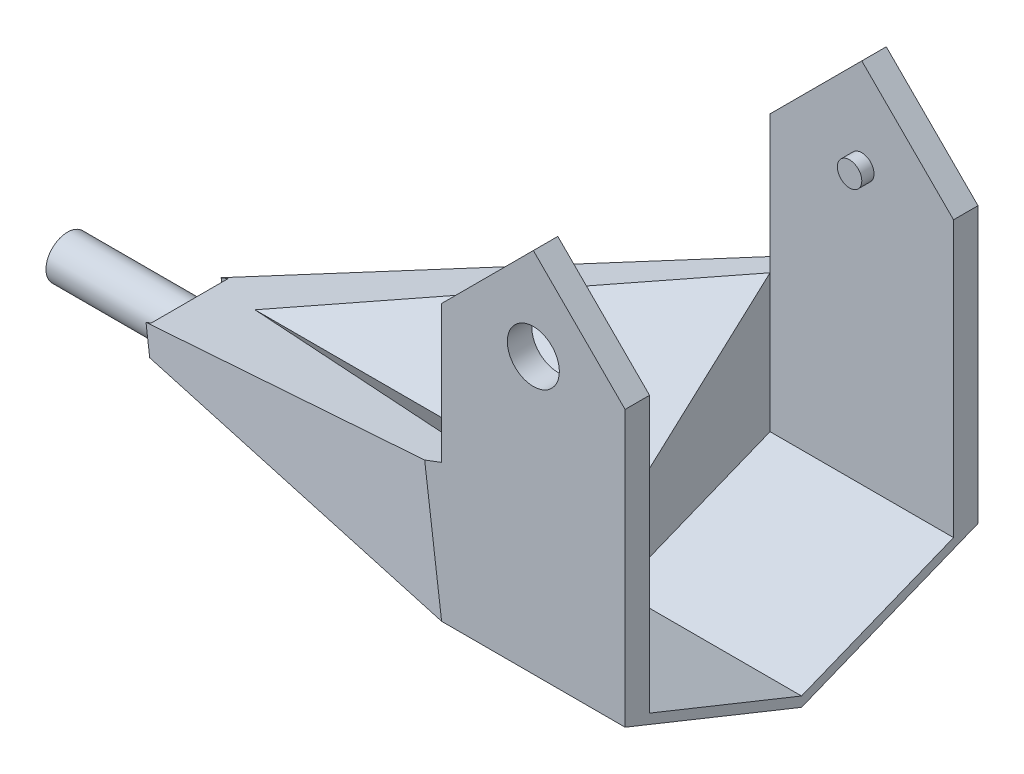
ISO-10303-21;
HEADER;
FILE_DESCRIPTION(('STEP AP214'),'2;1');
FILE_NAME('part.step','',(''),(''),'','','');
FILE_SCHEMA(('AUTOMOTIVE_DESIGN { 1 0 10303 214 1 1 1 1 }'));
ENDSEC;
DATA;
#1=APPLICATION_CONTEXT('core data for automotive mechanical design processes');
#2=APPLICATION_PROTOCOL_DEFINITION('international standard','automotive_design',2000,#1);
#3=PRODUCT_CONTEXT('',#1,'mechanical');
#4=PRODUCT('Part','Part','',(#3));
#5=PRODUCT_RELATED_PRODUCT_CATEGORY('part','',(#4));
#6=PRODUCT_DEFINITION_FORMATION('','',#4);
#7=PRODUCT_DEFINITION_CONTEXT('part definition',#1,'design');
#8=PRODUCT_DEFINITION('design','',#6,#7);
#9=PRODUCT_DEFINITION_SHAPE('','',#8);
#10=(LENGTH_UNIT() NAMED_UNIT(*) SI_UNIT(.MILLI.,.METRE.));
#11=(NAMED_UNIT(*) PLANE_ANGLE_UNIT() SI_UNIT($,.RADIAN.));
#12=(NAMED_UNIT(*) SI_UNIT($,.STERADIAN.) SOLID_ANGLE_UNIT());
#13=UNCERTAINTY_MEASURE_WITH_UNIT(LENGTH_MEASURE(1.E-05),#10,'distance_accuracy_value','');
#14=(GEOMETRIC_REPRESENTATION_CONTEXT(3) GLOBAL_UNCERTAINTY_ASSIGNED_CONTEXT((#13)) GLOBAL_UNIT_ASSIGNED_CONTEXT((#10,
#11,#12)) REPRESENTATION_CONTEXT('',''));
#15=CARTESIAN_POINT('',(0.,0.,0.));
#16=DIRECTION('',(0.,0.,1.));
#17=DIRECTION('',(1.,0.,0.));
#18=AXIS2_PLACEMENT_3D('',#15,#16,#17);
#19=CARTESIAN_POINT('',(-120.,-35.0000000000001,4.));
#20=DIRECTION('',(0.,-0.927702294982499,0.373320843088361));
#21=DIRECTION('',(0.,-0.373320843088361,-0.927702294982499));
#22=AXIS2_PLACEMENT_3D('',#19,#20,#21);
#23=PLANE('',#22);
#24=DIRECTION('',(0.,0.37332084308836,0.927702294982499));
#25=VECTOR('',#24,1.);
#26=CARTESIAN_POINT('',(-100.,-31.5074265956444,12.6790449089624));
#27=LINE('',#26,#25);
#28=CARTESIAN_POINT('',(-100.,-46.0330988555125,-23.417250653227));
#29=VERTEX_POINT('',#28);
#30=CARTESIAN_POINT('',(-100.,-44.0604240644672,-18.515153797966));
#31=VERTEX_POINT('',#30);
#32=EDGE_CURVE('E778',#29,#31,#27,.T.);
#33=ORIENTED_EDGE('',*,*,#32,.F.);
#34=DIRECTION('',(-1.,0.,0.));
#35=VECTOR('',#34,1.);
#36=CARTESIAN_POINT('',(-100.,-46.0330988555125,-23.417250653227));
#37=LINE('',#36,#35);
#38=CARTESIAN_POINT('',(-120.,-46.0330988555125,-23.417250653227));
#39=VERTEX_POINT('',#38);
#40=EDGE_CURVE('E785',#29,#39,#37,.T.);
#41=ORIENTED_EDGE('',*,*,#40,.T.);
#42=DIRECTION('',(0.,0.37332084308836,0.927702294982499));
#43=VECTOR('',#42,1.);
#44=CARTESIAN_POINT('',(-120.,-46.6096579488384,-24.8499999999997));
#45=LINE('',#44,#43);
#46=CARTESIAN_POINT('',(-120.,-46.1135386415643,-23.617143521546));
#47=VERTEX_POINT('',#46);
#48=EDGE_CURVE('E318',#47,#39,#45,.T.);
#49=ORIENTED_EDGE('',*,*,#48,.F.);
#50=DIRECTION('',(-1.,0.,0.));
#51=VECTOR('',#50,1.);
#52=CARTESIAN_POINT('',(-100.,-46.1135386415643,-23.617143521546));
#53=LINE('',#52,#51);
#54=CARTESIAN_POINT('',(-100.,-46.1135386415643,-23.617143521546));
#55=VERTEX_POINT('',#54);
#56=EDGE_CURVE('E788',#55,#47,#53,.T.);
#57=ORIENTED_EDGE('',*,*,#56,.F.);
#58=DIRECTION('',(0.,0.37332084308836,0.927702294982499));
#59=VECTOR('',#58,1.);
#60=CARTESIAN_POINT('',(-100.,-31.5074265956444,12.6790449089624));
#61=LINE('',#60,#59);
#62=CARTESIAN_POINT('',(-100.,-46.6096579488384,-24.8499999999997));
#63=VERTEX_POINT('',#62);
#64=EDGE_CURVE('E455',#63,#55,#61,.T.);
#65=ORIENTED_EDGE('',*,*,#64,.F.);
#66=DIRECTION('',(1.,0.,0.));
#67=VECTOR('',#66,1.);
#68=CARTESIAN_POINT('',(-120.,-46.6096579488384,-24.8499999999997));
#69=LINE('',#68,#67);
#70=CARTESIAN_POINT('',(0.,-46.6096579488384,-24.8499999999997));
#71=VERTEX_POINT('',#70);
#72=EDGE_CURVE('E239',#63,#71,#69,.T.);
#73=ORIENTED_EDGE('',*,*,#72,.T.);
#74=DIRECTION('',(0.,-0.373320843088361,-0.927702294982499));
#75=VECTOR('',#74,1.);
#76=CARTESIAN_POINT('',(0.,-35.0000000000001,4.));
#77=LINE('',#76,#75);
#78=CARTESIAN_POINT('',(0.,-35.0000000000001,4.));
#79=VERTEX_POINT('',#78);
#80=EDGE_CURVE('E396',#79,#71,#77,.T.);
#81=ORIENTED_EDGE('',*,*,#80,.F.);
#82=DIRECTION('',(1.,0.,0.));
#83=VECTOR('',#82,1.);
#84=CARTESIAN_POINT('',(-30.,-35.0000000000001,4.));
#85=LINE('',#84,#83);
#86=CARTESIAN_POINT('',(-30.,-35.0000000000001,4.));
#87=VERTEX_POINT('',#86);
#88=EDGE_CURVE('E356',#87,#79,#85,.T.);
#89=ORIENTED_EDGE('',*,*,#88,.F.);
#90=DIRECTION('',(0.945166123287086,0.121922837735474,0.30297825174258));
#91=VECTOR('',#90,1.);
#92=CARTESIAN_POINT('',(-110.400510054859,-45.3713602294339,-21.7728301675849));
#93=LINE('',#92,#91);
#94=CARTESIAN_POINT('',(-100.237914794349,-44.0604240644672,-18.515153797966));
#95=VERTEX_POINT('',#94);
#96=EDGE_CURVE('E345',#95,#87,#93,.T.);
#97=ORIENTED_EDGE('',*,*,#96,.F.);
#98=DIRECTION('',(-1.,0.,0.));
#99=VECTOR('',#98,1.);
#100=CARTESIAN_POINT('',(-100.,-44.0604240644672,-18.515153797966));
#101=LINE('',#100,#99);
#102=EDGE_CURVE('E792',#31,#95,#101,.T.);
#103=ORIENTED_EDGE('',*,*,#102,.F.);
#104=EDGE_LOOP('',(#33,#41,#49,#57,#65,#73,#81,#89,#97,#103));
#105=FACE_BOUND('',#104,.T.);
#106=ADVANCED_FACE('F48',(#105),#23,.T.);
#107=CARTESIAN_POINT('',(-120.,0.,0.));
#108=DIRECTION('',(-1.,0.,0.));
#109=DIRECTION('',(0.,0.,1.));
#110=AXIS2_PLACEMENT_3D('',#107,#108,#109);
#111=PLANE('',#110);
#112=CARTESIAN_POINT('',(-120.,-42.819695954523,-24.8265020348064));
#113=DIRECTION('',(-1.,0.,0.));
#114=DIRECTION('',(0.,0.,1.));
#115=AXIS2_PLACEMENT_3D('',#112,#113,#114);
#116=CIRCLE('',#115,3.);
#117=CARTESIAN_POINT('',(-120.,-42.819695954523,-21.8265020348063));
#118=VERTEX_POINT('',#117);
#119=EDGE_CURVE('E765',#118,#118,#116,.T.);
#120=ORIENTED_EDGE('',*,*,#119,.F.);
#121=EDGE_LOOP('',(#120));
#122=FACE_BOUND('',#121,.T.);
#123=ORIENTED_EDGE('',*,*,#48,.T.);
#124=CARTESIAN_POINT('',(-120.,-42.819695954523,-24.8265020348064));
#125=DIRECTION('',(-1.,0.,0.));
#126=DIRECTION('',(0.,0.,1.));
#127=AXIS2_PLACEMENT_3D('',#124,#125,#126);
#128=CIRCLE('',#127,3.50883850591199);
#129=EDGE_CURVE('E773',#39,#47,#128,.T.);
#130=ORIENTED_EDGE('',*,*,#129,.T.);
#131=EDGE_LOOP('',(#123,#130));
#132=FACE_BOUND('',#131,.T.);
#133=ADVANCED_FACE('F492',(#122,#132),#111,.T.);
#134=CARTESIAN_POINT('',(0.,10.,4.));
#135=DIRECTION('',(-1.,0.,0.));
#136=DIRECTION('',(0.,-1.,0.));
#137=AXIS2_PLACEMENT_3D('',#134,#135,#136);
#138=PLANE('',#137);
#139=DIRECTION('',(0.,1.,0.));
#140=VECTOR('',#139,1.);
#141=CARTESIAN_POINT('',(0.,10.,-49.7));
#142=LINE('',#141,#140);
#143=CARTESIAN_POINT('',(0.,-35.0000000000001,-49.7));
#144=VERTEX_POINT('',#143);
#145=CARTESIAN_POINT('',(0.,10.,-49.7));
#146=VERTEX_POINT('',#145);
#147=EDGE_CURVE('E251',#144,#146,#142,.T.);
#148=ORIENTED_EDGE('',*,*,#147,.F.);
#149=DIRECTION('',(0.,-0.373320843056472,0.927702294995332));
#150=VECTOR('',#149,1.);
#151=CARTESIAN_POINT('',(0.,-45.0000000000001,-24.85));
#152=LINE('',#151,#150);
#153=CARTESIAN_POINT('',(0.,-45.0000000000001,-24.85));
#154=VERTEX_POINT('',#153);
#155=EDGE_CURVE('E242',#144,#154,#152,.T.);
#156=ORIENTED_EDGE('',*,*,#155,.T.);
#157=DIRECTION('',(0.,0.373320843056472,0.927702294995332));
#158=VECTOR('',#157,1.);
#159=CARTESIAN_POINT('',(0.,-45.0000000000001,-24.85));
#160=LINE('',#159,#158);
#161=CARTESIAN_POINT('',(0.,-35.0000000000001,0.));
#162=VERTEX_POINT('',#161);
#163=EDGE_CURVE('E393',#154,#162,#160,.T.);
#164=ORIENTED_EDGE('',*,*,#163,.T.);
#165=DIRECTION('',(0.,1.,0.));
#166=VECTOR('',#165,1.);
#167=CARTESIAN_POINT('',(0.,10.,0.));
#168=LINE('',#167,#166);
#169=CARTESIAN_POINT('',(0.,10.,0.));
#170=VERTEX_POINT('',#169);
#171=EDGE_CURVE('E369',#162,#170,#168,.T.);
#172=ORIENTED_EDGE('',*,*,#171,.T.);
#173=DIRECTION('',(0.,0.,-1.));
#174=VECTOR('',#173,1.);
#175=CARTESIAN_POINT('',(0.,10.,4.));
#176=LINE('',#175,#174);
#177=CARTESIAN_POINT('',(0.,10.,4.));
#178=VERTEX_POINT('',#177);
#179=EDGE_CURVE('E376',#178,#170,#176,.T.);
#180=ORIENTED_EDGE('',*,*,#179,.F.);
#181=DIRECTION('',(0.,1.,0.));
#182=VECTOR('',#181,1.);
#183=CARTESIAN_POINT('',(0.,10.,4.));
#184=LINE('',#183,#182);
#185=EDGE_CURVE('E374',#79,#178,#184,.T.);
#186=ORIENTED_EDGE('',*,*,#185,.F.);
#187=ORIENTED_EDGE('',*,*,#80,.T.);
#188=DIRECTION('',(0.,0.373320843088355,-0.927702294982501));
#189=VECTOR('',#188,1.);
#190=CARTESIAN_POINT('',(0.,-35.0000000000001,-53.7));
#191=LINE('',#190,#189);
#192=CARTESIAN_POINT('',(0.,-35.0000000000001,-53.7));
#193=VERTEX_POINT('',#192);
#194=EDGE_CURVE('E398',#71,#193,#191,.T.);
#195=ORIENTED_EDGE('',*,*,#194,.T.);
#196=DIRECTION('',(0.,1.,0.));
#197=VECTOR('',#196,1.);
#198=CARTESIAN_POINT('',(0.,-35.0000000000001,-53.7));
#199=LINE('',#198,#197);
#200=CARTESIAN_POINT('',(0.,10.,-53.7));
#201=VERTEX_POINT('',#200);
#202=EDGE_CURVE('E234',#193,#201,#199,.T.);
#203=ORIENTED_EDGE('',*,*,#202,.T.);
#204=DIRECTION('',(0.,0.,1.));
#205=VECTOR('',#204,1.);
#206=CARTESIAN_POINT('',(0.,10.,-53.7));
#207=LINE('',#206,#205);
#208=EDGE_CURVE('E237',#201,#146,#207,.T.);
#209=ORIENTED_EDGE('',*,*,#208,.T.);
#210=EDGE_LOOP('',(#148,#156,#164,#172,#180,#186,#187,#195,#203,#209));
#211=FACE_BOUND('',#210,.T.);
#212=ADVANCED_FACE('F50',(#211),#138,.F.);
#213=CARTESIAN_POINT('',(0.,0.,-49.7));
#214=DIRECTION('',(0.,0.,1.));
#215=DIRECTION('',(1.,0.,0.));
#216=AXIS2_PLACEMENT_3D('',#213,#214,#215);
#217=PLANE('',#216);
#218=DIRECTION('',(0.,-1.,0.));
#219=VECTOR('',#218,1.);
#220=CARTESIAN_POINT('',(-30.,-35.0000000000001,-49.7));
#221=LINE('',#220,#219);
#222=CARTESIAN_POINT('',(-30.,10.,-49.7));
#223=VERTEX_POINT('',#222);
#224=CARTESIAN_POINT('',(-30.,-12.5,-49.7));
#225=VERTEX_POINT('',#224);
#226=EDGE_CURVE('E247',#223,#225,#221,.T.);
#227=ORIENTED_EDGE('',*,*,#226,.T.);
#228=DIRECTION('',(0.,1.,0.));
#229=VECTOR('',#228,1.);
#230=CARTESIAN_POINT('',(-30.,0.,-49.7));
#231=LINE('',#230,#229);
#232=CARTESIAN_POINT('',(-30.,-35.0000000000001,-49.7));
#233=VERTEX_POINT('',#232);
#234=EDGE_CURVE('E342',#233,#225,#231,.T.);
#235=ORIENTED_EDGE('',*,*,#234,.F.);
#236=DIRECTION('',(1.,0.,0.));
#237=VECTOR('',#236,1.);
#238=CARTESIAN_POINT('',(-53.7,-35.0000000000001,-49.7));
#239=LINE('',#238,#237);
#240=EDGE_CURVE('E280',#233,#144,#239,.T.);
#241=ORIENTED_EDGE('',*,*,#240,.T.);
#242=ORIENTED_EDGE('',*,*,#147,.T.);
#243=DIRECTION('',(-0.707106781186548,0.707106781186547,0.));
#244=VECTOR('',#243,1.);
#245=CARTESIAN_POINT('',(-15.,25.,-49.7));
#246=LINE('',#245,#244);
#247=CARTESIAN_POINT('',(-15.,25.,-49.7));
#248=VERTEX_POINT('',#247);
#249=EDGE_CURVE('E264',#146,#248,#246,.T.);
#250=ORIENTED_EDGE('',*,*,#249,.T.);
#251=DIRECTION('',(-0.707106781186548,-0.707106781186547,0.));
#252=VECTOR('',#251,1.);
#253=CARTESIAN_POINT('',(-30.,10.,-49.7));
#254=LINE('',#253,#252);
#255=EDGE_CURVE('E260',#248,#223,#254,.T.);
#256=ORIENTED_EDGE('',*,*,#255,.T.);
#257=EDGE_LOOP('',(#227,#235,#241,#242,#250,#256));
#258=FACE_BOUND('',#257,.T.);
#259=CARTESIAN_POINT('',(-15.,10.,-49.7));
#260=DIRECTION('',(0.,0.,1.));
#261=DIRECTION('',(1.,0.,0.));
#262=AXIS2_PLACEMENT_3D('',#259,#260,#261);
#263=CIRCLE('',#262,2.);
#264=CARTESIAN_POINT('',(-13.,10.,-49.7));
#265=VERTEX_POINT('',#264);
#266=EDGE_CURVE('E263',#265,#265,#263,.T.);
#267=ORIENTED_EDGE('',*,*,#266,.F.);
#268=EDGE_LOOP('',(#267));
#269=FACE_BOUND('',#268,.T.);
#270=ADVANCED_FACE('F473',(#258,#269),#217,.T.);
#271=CARTESIAN_POINT('',(0.,0.,-53.7));
#272=DIRECTION('',(0.,0.,-1.));
#273=DIRECTION('',(-1.,0.,0.));
#274=AXIS2_PLACEMENT_3D('',#271,#272,#273);
#275=PLANE('',#274);
#276=DIRECTION('',(0.127936160899403,-0.991782404932817,0.));
#277=VECTOR('',#276,1.);
#278=CARTESIAN_POINT('',(-36.8701718402979,18.2587151448922,-53.7));
#279=LINE('',#278,#277);
#280=CARTESIAN_POINT('',(-32.7671319800058,-13.5487325037477,-53.7));
#281=VERTEX_POINT('',#280);
#282=CARTESIAN_POINT('',(-30.,-35.0000000000001,-53.7));
#283=VERTEX_POINT('',#282);
#284=EDGE_CURVE('E328',#281,#283,#279,.T.);
#285=ORIENTED_EDGE('',*,*,#284,.F.);
#286=DIRECTION('',(-0.93509490070394,-0.354397413474604,0.));
#287=VECTOR('',#286,1.);
#288=CARTESIAN_POINT('',(-30.,-12.5,-53.7));
#289=LINE('',#288,#287);
#290=CARTESIAN_POINT('',(-30.,-12.5,-53.7));
#291=VERTEX_POINT('',#290);
#292=EDGE_CURVE('E333',#291,#281,#289,.T.);
#293=ORIENTED_EDGE('',*,*,#292,.F.);
#294=DIRECTION('',(0.,-1.,0.));
#295=VECTOR('',#294,1.);
#296=CARTESIAN_POINT('',(-30.,-35.0000000000001,-53.7));
#297=LINE('',#296,#295);
#298=CARTESIAN_POINT('',(-30.,10.,-53.7));
#299=VERTEX_POINT('',#298);
#300=EDGE_CURVE('E259',#299,#291,#297,.T.);
#301=ORIENTED_EDGE('',*,*,#300,.F.);
#302=DIRECTION('',(-0.707106781186548,-0.707106781186547,0.));
#303=VECTOR('',#302,1.);
#304=CARTESIAN_POINT('',(-30.,10.,-53.7));
#305=LINE('',#304,#303);
#306=CARTESIAN_POINT('',(-15.,25.,-53.7));
#307=VERTEX_POINT('',#306);
#308=EDGE_CURVE('E256',#307,#299,#305,.T.);
#309=ORIENTED_EDGE('',*,*,#308,.F.);
#310=DIRECTION('',(-0.707106781186548,0.707106781186547,0.));
#311=VECTOR('',#310,1.);
#312=CARTESIAN_POINT('',(-15.,25.,-53.7));
#313=LINE('',#312,#311);
#314=EDGE_CURVE('E252',#201,#307,#313,.T.);
#315=ORIENTED_EDGE('',*,*,#314,.F.);
#316=ORIENTED_EDGE('',*,*,#202,.F.);
#317=DIRECTION('',(1.,0.,0.));
#318=VECTOR('',#317,1.);
#319=CARTESIAN_POINT('',(-30.,-35.0000000000001,-53.7));
#320=LINE('',#319,#318);
#321=EDGE_CURVE('E245',#283,#193,#320,.T.);
#322=ORIENTED_EDGE('',*,*,#321,.F.);
#323=EDGE_LOOP('',(#285,#293,#301,#309,#315,#316,#322));
#324=FACE_BOUND('',#323,.T.);
#325=ADVANCED_FACE('F463',(#324),#275,.T.);
#326=CARTESIAN_POINT('',(-30.,-35.0000000000001,-53.7));
#327=DIRECTION('',(-1.,0.,0.));
#328=DIRECTION('',(0.,-1.,0.));
#329=AXIS2_PLACEMENT_3D('',#326,#327,#328);
#330=PLANE('',#329);
#331=DIRECTION('',(0.,0.,1.));
#332=VECTOR('',#331,1.);
#333=CARTESIAN_POINT('',(-30.,-12.5,-53.7));
#334=LINE('',#333,#332);
#335=EDGE_CURVE('E336',#291,#225,#334,.T.);
#336=ORIENTED_EDGE('',*,*,#335,.T.);
#337=ORIENTED_EDGE('',*,*,#226,.F.);
#338=DIRECTION('',(0.,0.,1.));
#339=VECTOR('',#338,1.);
#340=CARTESIAN_POINT('',(-30.,10.,-53.7));
#341=LINE('',#340,#339);
#342=EDGE_CURVE('E253',#299,#223,#341,.T.);
#343=ORIENTED_EDGE('',*,*,#342,.F.);
#344=ORIENTED_EDGE('',*,*,#300,.T.);
#345=EDGE_LOOP('',(#336,#337,#343,#344));
#346=FACE_BOUND('',#345,.T.);
#347=ADVANCED_FACE('F476',(#346),#330,.T.);
#348=CARTESIAN_POINT('',(-30.,10.,-53.7));
#349=DIRECTION('',(-0.707106781186547,0.707106781186548,0.));
#350=DIRECTION('',(-0.707106781186548,-0.707106781186547,0.));
#351=AXIS2_PLACEMENT_3D('',#348,#349,#350);
#352=PLANE('',#351);
#353=ORIENTED_EDGE('',*,*,#255,.F.);
#354=DIRECTION('',(0.,0.,1.));
#355=VECTOR('',#354,1.);
#356=CARTESIAN_POINT('',(-15.,25.,-53.7));
#357=LINE('',#356,#355);
#358=EDGE_CURVE('E249',#307,#248,#357,.T.);
#359=ORIENTED_EDGE('',*,*,#358,.F.);
#360=ORIENTED_EDGE('',*,*,#308,.T.);
#361=ORIENTED_EDGE('',*,*,#342,.T.);
#362=EDGE_LOOP('',(#353,#359,#360,#361));
#363=FACE_BOUND('',#362,.T.);
#364=ADVANCED_FACE('F481',(#363),#352,.T.);
#365=CARTESIAN_POINT('',(-15.,25.,-53.7));
#366=DIRECTION('',(0.707106781186547,0.707106781186548,0.));
#367=DIRECTION('',(-0.707106781186548,0.707106781186547,0.));
#368=AXIS2_PLACEMENT_3D('',#365,#366,#367);
#369=PLANE('',#368);
#370=ORIENTED_EDGE('',*,*,#249,.F.);
#371=ORIENTED_EDGE('',*,*,#208,.F.);
#372=ORIENTED_EDGE('',*,*,#314,.T.);
#373=ORIENTED_EDGE('',*,*,#358,.T.);
#374=EDGE_LOOP('',(#370,#371,#372,#373));
#375=FACE_BOUND('',#374,.T.);
#376=ADVANCED_FACE('F470',(#375),#369,.T.);
#377=CARTESIAN_POINT('',(-15.,10.,-47.7));
#378=DIRECTION('',(0.,0.,-1.));
#379=DIRECTION('',(-1.,0.,0.));
#380=AXIS2_PLACEMENT_3D('',#377,#378,#379);
#381=CYLINDRICAL_SURFACE('',#380,2.);
#382=CARTESIAN_POINT('',(-15.,10.,-47.7));
#383=DIRECTION('',(0.,0.,1.));
#384=DIRECTION('',(1.,0.,0.));
#385=AXIS2_PLACEMENT_3D('',#382,#383,#384);
#386=CIRCLE('',#385,2.);
#387=CARTESIAN_POINT('',(-13.,10.,-47.7));
#388=VERTEX_POINT('',#387);
#389=EDGE_CURVE('E277',#388,#388,#386,.T.);
#390=ORIENTED_EDGE('',*,*,#389,.F.);
#391=EDGE_LOOP('',(#390));
#392=FACE_BOUND('',#391,.T.);
#393=ORIENTED_EDGE('',*,*,#266,.T.);
#394=EDGE_LOOP('',(#393));
#395=FACE_BOUND('',#394,.T.);
#396=ADVANCED_FACE('F487',(#392,#395),#381,.T.);
#397=CARTESIAN_POINT('',(-15.,10.,-47.7));
#398=DIRECTION('',(0.,0.,1.));
#399=DIRECTION('',(1.,0.,0.));
#400=AXIS2_PLACEMENT_3D('',#397,#398,#399);
#401=PLANE('',#400);
#402=ORIENTED_EDGE('',*,*,#389,.T.);
#403=EDGE_LOOP('',(#402));
#404=FACE_BOUND('',#403,.T.);
#405=ADVANCED_FACE('F506',(#404),#401,.T.);
#406=CARTESIAN_POINT('',(-120.,-45.0000000000001,-24.85));
#407=DIRECTION('',(0.,0.927702294995332,-0.373320843056472));
#408=DIRECTION('',(0.,0.373320843056472,0.927702294995332));
#409=AXIS2_PLACEMENT_3D('',#406,#407,#408);
#410=PLANE('',#409);
#411=DIRECTION('',(0.,-0.373320843056472,-0.927702294995332));
#412=VECTOR('',#411,1.);
#413=CARTESIAN_POINT('',(-30.,-45.0000000000001,-24.85));
#414=LINE('',#413,#412);
#415=CARTESIAN_POINT('',(-30.,-35.0000000000001,0.));
#416=VERTEX_POINT('',#415);
#417=CARTESIAN_POINT('',(-30.,-45.0000000000001,-24.85));
#418=VERTEX_POINT('',#417);
#419=EDGE_CURVE('E411',#416,#418,#414,.T.);
#420=ORIENTED_EDGE('',*,*,#419,.F.);
#421=DIRECTION('',(1.,0.,0.));
#422=VECTOR('',#421,1.);
#423=CARTESIAN_POINT('',(-53.7,-35.0000000000001,0.));
#424=LINE('',#423,#422);
#425=EDGE_CURVE('E353',#416,#162,#424,.T.);
#426=ORIENTED_EDGE('',*,*,#425,.T.);
#427=ORIENTED_EDGE('',*,*,#163,.F.);
#428=DIRECTION('',(1.,0.,0.));
#429=VECTOR('',#428,1.);
#430=CARTESIAN_POINT('',(-120.,-45.0000000000001,-24.85));
#431=LINE('',#430,#429);
#432=EDGE_CURVE('E235',#418,#154,#431,.T.);
#433=ORIENTED_EDGE('',*,*,#432,.F.);
#434=EDGE_LOOP('',(#420,#426,#427,#433));
#435=FACE_BOUND('',#434,.T.);
#436=ADVANCED_FACE('F410',(#435),#410,.T.);
#437=CARTESIAN_POINT('',(-120.,-45.0000000000001,-24.85));
#438=DIRECTION('',(0.,0.927702294995332,0.373320843056472));
#439=DIRECTION('',(0.,-0.373320843056472,0.927702294995332));
#440=AXIS2_PLACEMENT_3D('',#437,#438,#439);
#441=PLANE('',#440);
#442=DIRECTION('',(0.,0.373320843056472,-0.927702294995332));
#443=VECTOR('',#442,1.);
#444=CARTESIAN_POINT('',(-30.,-35.0000000000001,-49.7));
#445=LINE('',#444,#443);
#446=EDGE_CURVE('E64',#418,#233,#445,.T.);
#447=ORIENTED_EDGE('',*,*,#446,.F.);
#448=ORIENTED_EDGE('',*,*,#432,.T.);
#449=ORIENTED_EDGE('',*,*,#155,.F.);
#450=ORIENTED_EDGE('',*,*,#240,.F.);
#451=EDGE_LOOP('',(#447,#448,#449,#450));
#452=FACE_BOUND('',#451,.T.);
#453=ADVANCED_FACE('F406',(#452),#441,.T.);
#454=CARTESIAN_POINT('',(-120.,-35.0000000000001,-53.7));
#455=DIRECTION('',(0.,-0.927702294982501,-0.373320843088355));
#456=DIRECTION('',(0.,0.373320843088355,-0.927702294982502));
#457=AXIS2_PLACEMENT_3D('',#454,#455,#456);
#458=PLANE('',#457);
#459=DIRECTION('',(-1.,0.,0.));
#460=VECTOR('',#459,1.);
#461=CARTESIAN_POINT('',(-100.,-44.0982477508989,-31.09085434126));
#462=LINE('',#461,#460);
#463=CARTESIAN_POINT('',(-100.,-44.0982477508989,-31.09085434126));
#464=VERTEX_POINT('',#463);
#465=CARTESIAN_POINT('',(-100.531130304561,-44.0982477508989,-31.09085434126));
#466=VERTEX_POINT('',#465);
#467=EDGE_CURVE('E790',#464,#466,#462,.T.);
#468=ORIENTED_EDGE('',*,*,#467,.T.);
#469=DIRECTION('',(-0.945166123287084,-0.121922837735473,0.302978251742585));
#470=VECTOR('',#469,1.);
#471=CARTESIAN_POINT('',(-110.400510054858,-45.3713602294339,-27.9271698324146));
#472=LINE('',#471,#470);
#473=EDGE_CURVE('E347',#283,#466,#472,.T.);
#474=ORIENTED_EDGE('',*,*,#473,.F.);
#475=ORIENTED_EDGE('',*,*,#321,.T.);
#476=ORIENTED_EDGE('',*,*,#194,.F.);
#477=ORIENTED_EDGE('',*,*,#72,.F.);
#478=DIRECTION('',(0.,-0.373320843088354,0.927702294982502));
#479=VECTOR('',#478,1.);
#480=CARTESIAN_POINT('',(-100.,-48.7200575596686,-19.6056569676069));
#481=LINE('',#480,#479);
#482=EDGE_CURVE('E782',#464,#63,#481,.T.);
#483=ORIENTED_EDGE('',*,*,#482,.F.);
#484=EDGE_LOOP('',(#468,#474,#475,#476,#477,#483));
#485=FACE_BOUND('',#484,.T.);
#486=ADVANCED_FACE('F458',(#485),#458,.T.);
#487=CARTESIAN_POINT('',(-15.,10.,4.));
#488=DIRECTION('',(0.,0.,-1.));
#489=DIRECTION('',(-1.,0.,0.));
#490=AXIS2_PLACEMENT_3D('',#487,#488,#489);
#491=CYLINDRICAL_SURFACE('',#490,4.25);
#492=CARTESIAN_POINT('',(-15.,10.,4.));
#493=DIRECTION('',(0.,0.,1.));
#494=DIRECTION('',(1.,0.,0.));
#495=AXIS2_PLACEMENT_3D('',#492,#493,#494);
#496=CIRCLE('',#495,4.25);
#497=CARTESIAN_POINT('',(-10.75,10.,4.));
#498=VERTEX_POINT('',#497);
#499=EDGE_CURVE('E359',#498,#498,#496,.T.);
#500=ORIENTED_EDGE('',*,*,#499,.T.);
#501=EDGE_LOOP('',(#500));
#502=FACE_BOUND('',#501,.T.);
#503=CARTESIAN_POINT('',(-15.,10.,0.));
#504=DIRECTION('',(0.,0.,1.));
#505=DIRECTION('',(1.,0.,0.));
#506=AXIS2_PLACEMENT_3D('',#503,#504,#505);
#507=CIRCLE('',#506,4.25);
#508=CARTESIAN_POINT('',(-10.75,10.,0.));
#509=VERTEX_POINT('',#508);
#510=EDGE_CURVE('E358',#509,#509,#507,.T.);
#511=ORIENTED_EDGE('',*,*,#510,.F.);
#512=EDGE_LOOP('',(#511));
#513=FACE_BOUND('',#512,.T.);
#514=ADVANCED_FACE('F541',(#502,#513),#491,.F.);
#515=CARTESIAN_POINT('',(-30.,10.,4.));
#516=DIRECTION('',(0.707106781186547,-0.707106781186548,0.));
#517=DIRECTION('',(0.707106781186548,0.707106781186547,0.));
#518=AXIS2_PLACEMENT_3D('',#515,#516,#517);
#519=PLANE('',#518);
#520=DIRECTION('',(-0.707106781186548,-0.707106781186547,0.));
#521=VECTOR('',#520,1.);
#522=CARTESIAN_POINT('',(-30.,10.,0.));
#523=LINE('',#522,#521);
#524=CARTESIAN_POINT('',(-15.,25.,0.));
#525=VERTEX_POINT('',#524);
#526=CARTESIAN_POINT('',(-30.,10.,0.));
#527=VERTEX_POINT('',#526);
#528=EDGE_CURVE('E379',#525,#527,#523,.T.);
#529=ORIENTED_EDGE('',*,*,#528,.T.);
#530=DIRECTION('',(0.,0.,-1.));
#531=VECTOR('',#530,1.);
#532=CARTESIAN_POINT('',(-30.,10.,4.));
#533=LINE('',#532,#531);
#534=CARTESIAN_POINT('',(-30.,10.,4.));
#535=VERTEX_POINT('',#534);
#536=EDGE_CURVE('E387',#535,#527,#533,.T.);
#537=ORIENTED_EDGE('',*,*,#536,.F.);
#538=DIRECTION('',(-0.707106781186548,-0.707106781186547,0.));
#539=VECTOR('',#538,1.);
#540=CARTESIAN_POINT('',(-30.,10.,4.));
#541=LINE('',#540,#539);
#542=CARTESIAN_POINT('',(-15.,25.,4.));
#543=VERTEX_POINT('',#542);
#544=EDGE_CURVE('E368',#543,#535,#541,.T.);
#545=ORIENTED_EDGE('',*,*,#544,.F.);
#546=DIRECTION('',(0.,0.,-1.));
#547=VECTOR('',#546,1.);
#548=CARTESIAN_POINT('',(-15.,25.,4.));
#549=LINE('',#548,#547);
#550=EDGE_CURVE('E390',#543,#525,#549,.T.);
#551=ORIENTED_EDGE('',*,*,#550,.T.);
#552=EDGE_LOOP('',(#529,#537,#545,#551));
#553=FACE_BOUND('',#552,.T.);
#554=ADVANCED_FACE('F441',(#553),#519,.F.);
#555=CARTESIAN_POINT('',(-15.,25.,4.));
#556=DIRECTION('',(-0.707106781186547,-0.707106781186548,0.));
#557=DIRECTION('',(0.707106781186548,-0.707106781186547,0.));
#558=AXIS2_PLACEMENT_3D('',#555,#556,#557);
#559=PLANE('',#558);
#560=DIRECTION('',(-0.707106781186548,0.707106781186547,0.));
#561=VECTOR('',#560,1.);
#562=CARTESIAN_POINT('',(-15.,25.,0.));
#563=LINE('',#562,#561);
#564=EDGE_CURVE('E362',#170,#525,#563,.T.);
#565=ORIENTED_EDGE('',*,*,#564,.T.);
#566=ORIENTED_EDGE('',*,*,#550,.F.);
#567=DIRECTION('',(-0.707106781186548,0.707106781186547,0.));
#568=VECTOR('',#567,1.);
#569=CARTESIAN_POINT('',(-15.,25.,4.));
#570=LINE('',#569,#568);
#571=EDGE_CURVE('E365',#178,#543,#570,.T.);
#572=ORIENTED_EDGE('',*,*,#571,.F.);
#573=ORIENTED_EDGE('',*,*,#179,.T.);
#574=EDGE_LOOP('',(#565,#566,#572,#573));
#575=FACE_BOUND('',#574,.T.);
#576=ADVANCED_FACE('F443',(#575),#559,.F.);
#577=CARTESIAN_POINT('',(0.,0.,0.));
#578=DIRECTION('',(0.,0.,1.));
#579=DIRECTION('',(1.,0.,0.));
#580=AXIS2_PLACEMENT_3D('',#577,#578,#579);
#581=PLANE('',#580);
#582=ORIENTED_EDGE('',*,*,#171,.F.);
#583=ORIENTED_EDGE('',*,*,#425,.F.);
#584=DIRECTION('',(0.,1.,0.));
#585=VECTOR('',#584,1.);
#586=CARTESIAN_POINT('',(-30.,0.,0.));
#587=LINE('',#586,#585);
#588=CARTESIAN_POINT('',(-30.,-12.5,0.));
#589=VERTEX_POINT('',#588);
#590=EDGE_CURVE('E339',#416,#589,#587,.T.);
#591=ORIENTED_EDGE('',*,*,#590,.T.);
#592=DIRECTION('',(0.,-1.,0.));
#593=VECTOR('',#592,1.);
#594=CARTESIAN_POINT('',(-30.,10.,0.));
#595=LINE('',#594,#593);
#596=EDGE_CURVE('E381',#527,#589,#595,.T.);
#597=ORIENTED_EDGE('',*,*,#596,.F.);
#598=ORIENTED_EDGE('',*,*,#528,.F.);
#599=ORIENTED_EDGE('',*,*,#564,.F.);
#600=EDGE_LOOP('',(#582,#583,#591,#597,#598,#599));
#601=FACE_BOUND('',#600,.T.);
#602=ORIENTED_EDGE('',*,*,#510,.T.);
#603=EDGE_LOOP('',(#602));
#604=FACE_BOUND('',#603,.T.);
#605=ADVANCED_FACE('F414',(#601,#604),#581,.F.);
#606=CARTESIAN_POINT('',(-30.,10.,4.));
#607=DIRECTION('',(1.,0.,0.));
#608=DIRECTION('',(0.,1.,0.));
#609=AXIS2_PLACEMENT_3D('',#606,#607,#608);
#610=PLANE('',#609);
#611=ORIENTED_EDGE('',*,*,#596,.T.);
#612=CARTESIAN_POINT('',(-30.,-12.5,4.));
#613=VERTEX_POINT('',#612);
#614=EDGE_CURVE('E335',#589,#613,#334,.T.);
#615=ORIENTED_EDGE('',*,*,#614,.T.);
#616=DIRECTION('',(0.,-1.,0.));
#617=VECTOR('',#616,1.);
#618=CARTESIAN_POINT('',(-30.,10.,4.));
#619=LINE('',#618,#617);
#620=EDGE_CURVE('E371',#535,#613,#619,.T.);
#621=ORIENTED_EDGE('',*,*,#620,.F.);
#622=ORIENTED_EDGE('',*,*,#536,.T.);
#623=EDGE_LOOP('',(#611,#615,#621,#622));
#624=FACE_BOUND('',#623,.T.);
#625=ADVANCED_FACE('F433',(#624),#610,.F.);
#626=CARTESIAN_POINT('',(0.,0.,4.));
#627=DIRECTION('',(0.,0.,1.));
#628=DIRECTION('',(1.,0.,0.));
#629=AXIS2_PLACEMENT_3D('',#626,#627,#628);
#630=PLANE('',#629);
#631=DIRECTION('',(0.127936160899403,-0.991782404932817,0.));
#632=VECTOR('',#631,1.);
#633=CARTESIAN_POINT('',(-36.8701718402979,18.2587151448922,4.));
#634=LINE('',#633,#632);
#635=CARTESIAN_POINT('',(-32.7671319800058,-13.5487325037477,4.00000000000001));
#636=VERTEX_POINT('',#635);
#637=EDGE_CURVE('E325',#636,#87,#634,.T.);
#638=ORIENTED_EDGE('',*,*,#637,.T.);
#639=ORIENTED_EDGE('',*,*,#88,.T.);
#640=ORIENTED_EDGE('',*,*,#185,.T.);
#641=ORIENTED_EDGE('',*,*,#571,.T.);
#642=ORIENTED_EDGE('',*,*,#544,.T.);
#643=ORIENTED_EDGE('',*,*,#620,.T.);
#644=DIRECTION('',(-0.93509490070394,-0.354397413474604,0.));
#645=VECTOR('',#644,1.);
#646=CARTESIAN_POINT('',(-30.,-12.5,4.));
#647=LINE('',#646,#645);
#648=EDGE_CURVE('E330',#613,#636,#647,.T.);
#649=ORIENTED_EDGE('',*,*,#648,.T.);
#650=EDGE_LOOP('',(#638,#639,#640,#641,#642,#643,#649));
#651=FACE_BOUND('',#650,.T.);
#652=ORIENTED_EDGE('',*,*,#499,.F.);
#653=EDGE_LOOP('',(#652));
#654=FACE_BOUND('',#653,.T.);
#655=ADVANCED_FACE('F435',(#651,#654),#630,.T.);
#656=CARTESIAN_POINT('',(-30.,-35.0000000000001,-53.7));
#657=DIRECTION('',(1.,0.,0.));
#658=DIRECTION('',(0.,1.,0.));
#659=AXIS2_PLACEMENT_3D('',#656,#657,#658);
#660=PLANE('',#659);
#661=DIRECTION('',(0.,-0.671186662800104,-0.741288380914782));
#662=VECTOR('',#661,1.);
#663=CARTESIAN_POINT('',(-30.,-12.5,0.));
#664=LINE('',#663,#662);
#665=CARTESIAN_POINT('',(-30.,-35.0000000000001,-24.85));
#666=VERTEX_POINT('',#665);
#667=EDGE_CURVE('E220',#589,#666,#664,.T.);
#668=ORIENTED_EDGE('',*,*,#667,.F.);
#669=ORIENTED_EDGE('',*,*,#590,.F.);
#670=ORIENTED_EDGE('',*,*,#419,.T.);
#671=ORIENTED_EDGE('',*,*,#446,.T.);
#672=ORIENTED_EDGE('',*,*,#234,.T.);
#673=DIRECTION('',(0.,0.671186662800105,-0.741288380914781));
#674=VECTOR('',#673,1.);
#675=CARTESIAN_POINT('',(-30.,-35.0000000000001,-24.85));
#676=LINE('',#675,#674);
#677=EDGE_CURVE('E424',#666,#225,#676,.T.);
#678=ORIENTED_EDGE('',*,*,#677,.F.);
#679=EDGE_LOOP('',(#668,#669,#670,#671,#672,#678));
#680=FACE_BOUND('',#679,.T.);
#681=ADVANCED_FACE('F420',(#680),#660,.T.);
#682=CARTESIAN_POINT('',(-30.,-12.5,-53.7));
#683=DIRECTION('',(-0.354397413474604,0.93509490070394,0.));
#684=DIRECTION('',(-0.93509490070394,-0.354397413474604,0.));
#685=AXIS2_PLACEMENT_3D('',#682,#683,#684);
#686=PLANE('',#685);
#687=DIRECTION('',(-0.87076848545193,-0.330017946571037,0.364486487657345));
#688=VECTOR('',#687,1.);
#689=CARTESIAN_POINT('',(-28.7304666126997,-12.0188516711618,-50.2314015987392));
#690=LINE('',#689,#688);
#691=CARTESIAN_POINT('',(-89.3673499463798,-35.0000000000001,-24.85));
#692=VERTEX_POINT('',#691);
#693=EDGE_CURVE('E479',#225,#692,#690,.T.);
#694=ORIENTED_EDGE('',*,*,#693,.F.);
#695=ORIENTED_EDGE('',*,*,#335,.F.);
#696=ORIENTED_EDGE('',*,*,#292,.T.);
#697=DIRECTION('',(0.893349938661678,0.338576231515173,-0.295452233950193));
#698=VECTOR('',#697,1.);
#699=CARTESIAN_POINT('',(-30.2415485471869,-12.5915459813621,-54.5352709671328));
#700=LINE('',#699,#698);
#701=CARTESIAN_POINT('',(-101.129718437325,-39.4578929543818,-31.09085434126));
#702=VERTEX_POINT('',#701);
#703=EDGE_CURVE('E283',#702,#281,#700,.T.);
#704=ORIENTED_EDGE('',*,*,#703,.F.);
#705=DIRECTION('',(-0.93509490070394,-0.354397413474604,0.));
#706=VECTOR('',#705,1.);
#707=CARTESIAN_POINT('',(-30.,-12.5,-31.09085434126));
#708=LINE('',#707,#706);
#709=CARTESIAN_POINT('',(-100.,-39.0297339602076,-31.09085434126));
#710=VERTEX_POINT('',#709);
#711=EDGE_CURVE('E308',#710,#702,#708,.T.);
#712=ORIENTED_EDGE('',*,*,#711,.F.);
#713=DIRECTION('',(0.,0.,-1.));
#714=VECTOR('',#713,1.);
#715=CARTESIAN_POINT('',(-100.,-39.0297339602076,-53.7));
#716=LINE('',#715,#714);
#717=CARTESIAN_POINT('',(-100.,-39.0297339602076,-18.515153797966));
#718=VERTEX_POINT('',#717);
#719=EDGE_CURVE('E57',#718,#710,#716,.T.);
#720=ORIENTED_EDGE('',*,*,#719,.F.);
#721=DIRECTION('',(0.93509490070394,0.354397413474604,0.));
#722=VECTOR('',#721,1.);
#723=CARTESIAN_POINT('',(-30.,-12.5,-18.515153797966));
#724=LINE('',#723,#722);
#725=CARTESIAN_POINT('',(-100.845518105062,-39.3501821085764,-18.515153797966));
#726=VERTEX_POINT('',#725);
#727=EDGE_CURVE('E314',#726,#718,#724,.T.);
#728=ORIENTED_EDGE('',*,*,#727,.F.);
#729=DIRECTION('',(-0.89334993866168,-0.338576231515173,-0.295452233950188));
#730=VECTOR('',#729,1.);
#731=CARTESIAN_POINT('',(-45.4710155111215,-18.3634560800614,-0.201478733780458));
#732=LINE('',#731,#730);
#733=EDGE_CURVE('E285',#636,#726,#732,.T.);
#734=ORIENTED_EDGE('',*,*,#733,.F.);
#735=ORIENTED_EDGE('',*,*,#648,.F.);
#736=ORIENTED_EDGE('',*,*,#614,.F.);
#737=DIRECTION('',(0.87076848545193,0.330017946571037,0.364486487657345));
#738=VECTOR('',#737,1.);
#739=CARTESIAN_POINT('',(-47.0434857245068,-18.9594163146538,-7.13406646307314));
#740=LINE('',#739,#738);
#741=EDGE_CURVE('E429',#692,#589,#740,.T.);
#742=ORIENTED_EDGE('',*,*,#741,.F.);
#743=EDGE_LOOP('',(#694,#695,#696,#704,#712,#720,#728,#734,#735,#736,#742));
#744=FACE_BOUND('',#743,.T.);
#745=ADVANCED_FACE('F310',(#744),#686,.T.);
#746=CARTESIAN_POINT('',(-126.870171840298,6.64905719605385,-24.8499999999997));
#747=DIRECTION('',(0.300488499155601,0.0387618743639591,0.952997470600529));
#748=DIRECTION('',(0.953714209571434,0.,-0.300714493268175));
#749=AXIS2_PLACEMENT_3D('',#746,#747,#748);
#750=PLANE('',#749);
#751=ORIENTED_EDGE('',*,*,#473,.T.);
#752=DIRECTION('',(-0.127936160899403,0.991782404932817,0.));
#753=VECTOR('',#752,1.);
#754=CARTESIAN_POINT('',(-107.401302144859,9.16046739399336,-31.09085434126));
#755=LINE('',#754,#753);
#756=EDGE_CURVE('E291',#466,#702,#755,.T.);
#757=ORIENTED_EDGE('',*,*,#756,.T.);
#758=ORIENTED_EDGE('',*,*,#703,.T.);
#759=ORIENTED_EDGE('',*,*,#284,.T.);
#760=EDGE_LOOP('',(#751,#757,#758,#759));
#761=FACE_BOUND('',#760,.T.);
#762=ADVANCED_FACE('F614',(#761),#750,.F.);
#763=CARTESIAN_POINT('',(-126.870171840298,6.64905719605387,-24.8499999999997));
#764=DIRECTION('',(0.300488499155596,0.0387618743639585,-0.952997470600531));
#765=DIRECTION('',(-0.953714209571435,0.,-0.30071449326817));
#766=AXIS2_PLACEMENT_3D('',#763,#764,#765);
#767=PLANE('',#766);
#768=ORIENTED_EDGE('',*,*,#733,.T.);
#769=DIRECTION('',(0.127936160899403,-0.991782404932817,0.));
#770=VECTOR('',#769,1.);
#771=CARTESIAN_POINT('',(-107.108086634647,9.1982910804251,-18.515153797966));
#772=LINE('',#771,#770);
#773=EDGE_CURVE('E288',#726,#95,#772,.T.);
#774=ORIENTED_EDGE('',*,*,#773,.T.);
#775=ORIENTED_EDGE('',*,*,#96,.T.);
#776=ORIENTED_EDGE('',*,*,#637,.F.);
#777=EDGE_LOOP('',(#768,#774,#775,#776));
#778=FACE_BOUND('',#777,.T.);
#779=ADVANCED_FACE('F622',(#778),#767,.F.);
#780=CARTESIAN_POINT('',(-100.,-42.819695954523,-24.8265020348064));
#781=DIRECTION('',(-1.,0.,0.));
#782=DIRECTION('',(0.,0.,1.));
#783=AXIS2_PLACEMENT_3D('',#780,#781,#782);
#784=CYLINDRICAL_SURFACE('',#783,3.50883850591199);
#785=ORIENTED_EDGE('',*,*,#129,.F.);
#786=ORIENTED_EDGE('',*,*,#40,.F.);
#787=CARTESIAN_POINT('',(-100.,-42.819695954523,-24.8265020348064));
#788=DIRECTION('',(-1.,0.,0.));
#789=DIRECTION('',(0.,0.,1.));
#790=AXIS2_PLACEMENT_3D('',#787,#788,#789);
#791=CIRCLE('',#790,3.50883850591199);
#792=EDGE_CURVE('E776',#29,#55,#791,.T.);
#793=ORIENTED_EDGE('',*,*,#792,.T.);
#794=ORIENTED_EDGE('',*,*,#56,.T.);
#795=EDGE_LOOP('',(#785,#786,#793,#794));
#796=FACE_BOUND('',#795,.T.);
#797=ADVANCED_FACE('F631',(#796),#784,.T.);
#798=CARTESIAN_POINT('',(-100.,0.,-31.0908543412601));
#799=DIRECTION('',(0.,0.,-1.));
#800=DIRECTION('',(0.,1.,0.));
#801=AXIS2_PLACEMENT_3D('',#798,#799,#800);
#802=PLANE('',#801);
#803=ORIENTED_EDGE('',*,*,#711,.T.);
#804=ORIENTED_EDGE('',*,*,#756,.F.);
#805=ORIENTED_EDGE('',*,*,#467,.F.);
#806=DIRECTION('',(0.,-1.,0.));
#807=VECTOR('',#806,1.);
#808=CARTESIAN_POINT('',(-100.,0.,-31.0908543412601));
#809=LINE('',#808,#807);
#810=EDGE_CURVE('E300',#710,#464,#809,.T.);
#811=ORIENTED_EDGE('',*,*,#810,.F.);
#812=EDGE_LOOP('',(#803,#804,#805,#811));
#813=FACE_BOUND('',#812,.T.);
#814=ADVANCED_FACE('F663',(#813),#802,.F.);
#815=CARTESIAN_POINT('',(-100.,0.,-18.5151537979659));
#816=DIRECTION('',(0.,0.,1.));
#817=DIRECTION('',(0.,-1.,0.));
#818=AXIS2_PLACEMENT_3D('',#815,#816,#817);
#819=PLANE('',#818);
#820=ORIENTED_EDGE('',*,*,#727,.T.);
#821=DIRECTION('',(0.,1.,0.));
#822=VECTOR('',#821,1.);
#823=CARTESIAN_POINT('',(-100.,0.,-18.5151537979659));
#824=LINE('',#823,#822);
#825=EDGE_CURVE('E303',#31,#718,#824,.T.);
#826=ORIENTED_EDGE('',*,*,#825,.F.);
#827=ORIENTED_EDGE('',*,*,#102,.T.);
#828=ORIENTED_EDGE('',*,*,#773,.F.);
#829=EDGE_LOOP('',(#820,#826,#827,#828));
#830=FACE_BOUND('',#829,.T.);
#831=ADVANCED_FACE('F672',(#830),#819,.F.);
#832=CARTESIAN_POINT('',(-100.,0.,0.));
#833=DIRECTION('',(-1.,0.,0.));
#834=DIRECTION('',(0.,0.,1.));
#835=AXIS2_PLACEMENT_3D('',#832,#833,#834);
#836=PLANE('',#835);
#837=ORIENTED_EDGE('',*,*,#792,.F.);
#838=ORIENTED_EDGE('',*,*,#32,.T.);
#839=ORIENTED_EDGE('',*,*,#825,.T.);
#840=ORIENTED_EDGE('',*,*,#719,.T.);
#841=ORIENTED_EDGE('',*,*,#810,.T.);
#842=ORIENTED_EDGE('',*,*,#482,.T.);
#843=ORIENTED_EDGE('',*,*,#64,.T.);
#844=EDGE_LOOP('',(#837,#838,#839,#840,#841,#842,#843));
#845=FACE_BOUND('',#844,.T.);
#846=ADVANCED_FACE('F299',(#845),#836,.T.);
#847=CARTESIAN_POINT('',(-110.,-42.819695954523,-24.8265020348064));
#848=DIRECTION('',(-1.,0.,0.));
#849=DIRECTION('',(0.,0.,1.));
#850=AXIS2_PLACEMENT_3D('',#847,#848,#849);
#851=CYLINDRICAL_SURFACE('',#850,3.);
#852=CARTESIAN_POINT('',(-110.,-42.819695954523,-24.8265020348064));
#853=DIRECTION('',(-1.,0.,0.));
#854=DIRECTION('',(0.,0.,1.));
#855=AXIS2_PLACEMENT_3D('',#852,#853,#854);
#856=CIRCLE('',#855,3.);
#857=CARTESIAN_POINT('',(-110.,-42.819695954523,-21.8265020348063));
#858=VERTEX_POINT('',#857);
#859=EDGE_CURVE('E770',#858,#858,#856,.T.);
#860=ORIENTED_EDGE('',*,*,#859,.F.);
#861=EDGE_LOOP('',(#860));
#862=FACE_BOUND('',#861,.T.);
#863=ORIENTED_EDGE('',*,*,#119,.T.);
#864=EDGE_LOOP('',(#863));
#865=FACE_BOUND('',#864,.T.);
#866=ADVANCED_FACE('F687',(#862,#865),#851,.F.);
#867=CARTESIAN_POINT('',(-110.,-42.819695954523,-24.8265020348064));
#868=DIRECTION('',(-1.,0.,0.));
#869=DIRECTION('',(0.,0.,1.));
#870=AXIS2_PLACEMENT_3D('',#867,#868,#869);
#871=PLANE('',#870);
#872=ORIENTED_EDGE('',*,*,#859,.T.);
#873=EDGE_LOOP('',(#872));
#874=FACE_BOUND('',#873,.T.);
#875=ADVANCED_FACE('F695',(#874),#871,.T.);
#876=CARTESIAN_POINT('',(-129.,-35.0000000000001,-24.85));
#877=DIRECTION('',(0.,-0.741288380914781,-0.671186662800105));
#878=DIRECTION('',(0.,0.671186662800106,-0.741288380914781));
#879=AXIS2_PLACEMENT_3D('',#876,#877,#878);
#880=PLANE('',#879);
#881=ORIENTED_EDGE('',*,*,#693,.T.);
#882=DIRECTION('',(1.,0.,0.));
#883=VECTOR('',#882,1.);
#884=CARTESIAN_POINT('',(-129.,-35.0000000000001,-24.85));
#885=LINE('',#884,#883);
#886=EDGE_CURVE('E763',#692,#666,#885,.T.);
#887=ORIENTED_EDGE('',*,*,#886,.T.);
#888=ORIENTED_EDGE('',*,*,#677,.T.);
#889=EDGE_LOOP('',(#881,#887,#888));
#890=FACE_BOUND('',#889,.T.);
#891=ADVANCED_FACE('F705',(#890),#880,.F.);
#892=CARTESIAN_POINT('',(-129.,-12.5000000000001,0.));
#893=DIRECTION('',(0.,-0.741288380914782,0.671186662800104));
#894=DIRECTION('',(0.,-0.671186662800104,-0.741288380914782));
#895=AXIS2_PLACEMENT_3D('',#892,#893,#894);
#896=PLANE('',#895);
#897=ORIENTED_EDGE('',*,*,#741,.T.);
#898=ORIENTED_EDGE('',*,*,#667,.T.);
#899=ORIENTED_EDGE('',*,*,#886,.F.);
#900=EDGE_LOOP('',(#897,#898,#899));
#901=FACE_BOUND('',#900,.T.);
#902=ADVANCED_FACE('F714',(#901),#896,.F.);
#903=CLOSED_SHELL('',(#106,#133,#212,#270,#325,#347,#364,#376,#396,#405,#436,#453,#486,#514,
#554,#576,#605,#625,#655,#681,#745,#762,#779,#797,#814,#831,#846,#866,#875,#891,#902));
#904=CARTESIAN_POINT('',(-100.,0.,0.));
#905=DIRECTION('',(-1.,0.,0.));
#906=DIRECTION('',(0.,0.,1.));
#907=AXIS2_PLACEMENT_3D('',#904,#905,#906);
#908=PLANE('',#907);
#909=DIRECTION('',(0.,-0.373320843056472,-0.927702294995332));
#910=VECTOR('',#909,1.);
#911=CARTESIAN_POINT('',(-100.,-45.0000000000001,-24.85));
#912=LINE('',#911,#910);
#913=CARTESIAN_POINT('',(-100.,-44.0297339602077,-22.4388888911158));
#914=VERTEX_POINT('',#913);
#915=CARTESIAN_POINT('',(-100.,-45.0000000000001,-24.85));
#916=VERTEX_POINT('',#915);
#917=EDGE_CURVE('E323',#914,#916,#912,.T.);
#918=ORIENTED_EDGE('',*,*,#917,.T.);
#919=DIRECTION('',(0.,0.373320843056472,-0.927702294995332));
#920=VECTOR('',#919,1.);
#921=CARTESIAN_POINT('',(-100.,-45.0000000000001,-24.85));
#922=LINE('',#921,#920);
#923=CARTESIAN_POINT('',(-100.,-44.0297339602077,-27.2611111088842));
#924=VERTEX_POINT('',#923);
#925=EDGE_CURVE('E233',#916,#924,#922,.T.);
#926=ORIENTED_EDGE('',*,*,#925,.T.);
#927=DIRECTION('',(0.,0.,1.));
#928=VECTOR('',#927,1.);
#929=CARTESIAN_POINT('',(-100.,-44.0297339602077,-53.7));
#930=LINE('',#929,#928);
#931=EDGE_CURVE('E313',#924,#914,#930,.T.);
#932=ORIENTED_EDGE('',*,*,#931,.T.);
#933=EDGE_LOOP('',(#918,#926,#932));
#934=FACE_BOUND('',#933,.T.);
#935=ADVANCED_FACE('F636',(#934),#908,.F.);
#936=CARTESIAN_POINT('',(-120.,-46.6096579488384,-53.7));
#937=DIRECTION('',(0.127936160899403,-0.991782404932817,0.));
#938=DIRECTION('',(0.991782404932817,0.127936160899403,0.));
#939=AXIS2_PLACEMENT_3D('',#936,#937,#938);
#940=PLANE('',#939);
#941=DIRECTION('',(0.945166123278475,0.121922837734363,-0.302978251769891));
#942=VECTOR('',#941,1.);
#943=CARTESIAN_POINT('',(-118.669048186825,-46.4379702233123,-21.2766439950691));
#944=LINE('',#943,#942);
#945=CARTESIAN_POINT('',(-42.,-36.5479543931785,-45.8533333329516));
#946=VERTEX_POINT('',#945);
#947=EDGE_CURVE('E350',#924,#946,#944,.T.);
#948=ORIENTED_EDGE('',*,*,#947,.T.);
#949=DIRECTION('',(0.,0.,1.));
#950=VECTOR('',#949,1.);
#951=CARTESIAN_POINT('',(-42.,-36.5479543931785,-53.7));
#952=LINE('',#951,#950);
#953=CARTESIAN_POINT('',(-42.,-36.5479543931785,-3.84666666704842));
#954=VERTEX_POINT('',#953);
#955=EDGE_CURVE('E11',#946,#954,#952,.T.);
#956=ORIENTED_EDGE('',*,*,#955,.T.);
#957=DIRECTION('',(-0.945166123278475,-0.121922837734363,-0.302978251769891));
#958=VECTOR('',#957,1.);
#959=CARTESIAN_POINT('',(-118.669048186825,-46.4379702233123,-28.4233560049309));
#960=LINE('',#959,#958);
#961=EDGE_CURVE('E229',#954,#914,#960,.T.);
#962=ORIENTED_EDGE('',*,*,#961,.T.);
#963=ORIENTED_EDGE('',*,*,#931,.F.);
#964=EDGE_LOOP('',(#948,#956,#962,#963));
#965=FACE_BOUND('',#964,.T.);
#966=ADVANCED_FACE('F640',(#965),#940,.T.);
#967=CARTESIAN_POINT('',(-42.,-45.0000000000001,-24.85));
#968=VERTEX_POINT('',#967);
#969=EDGE_CURVE('E227',#916,#968,#431,.T.);
#970=ORIENTED_EDGE('',*,*,#969,.T.);
#971=DIRECTION('',(0.,0.373320843056472,-0.927702294995332));
#972=VECTOR('',#971,1.);
#973=CARTESIAN_POINT('',(-42.,-35.0000000000001,-49.7));
#974=LINE('',#973,#972);
#975=EDGE_CURVE('E214',#968,#946,#974,.T.);
#976=ORIENTED_EDGE('',*,*,#975,.T.);
#977=ORIENTED_EDGE('',*,*,#947,.F.);
#978=ORIENTED_EDGE('',*,*,#925,.F.);
#979=EDGE_LOOP('',(#970,#976,#977,#978));
#980=FACE_BOUND('',#979,.T.);
#981=ADVANCED_FACE('F231',(#980),#441,.T.);
#982=ORIENTED_EDGE('',*,*,#961,.F.);
#983=DIRECTION('',(0.,-0.373320843056472,-0.927702294995332));
#984=VECTOR('',#983,1.);
#985=CARTESIAN_POINT('',(-42.,-45.0000000000001,-24.85));
#986=LINE('',#985,#984);
#987=EDGE_CURVE('E72',#954,#968,#986,.T.);
#988=ORIENTED_EDGE('',*,*,#987,.T.);
#989=ORIENTED_EDGE('',*,*,#969,.F.);
#990=ORIENTED_EDGE('',*,*,#917,.F.);
#991=EDGE_LOOP('',(#982,#988,#989,#990));
#992=FACE_BOUND('',#991,.T.);
#993=ADVANCED_FACE('F225',(#992),#410,.T.);
#994=CARTESIAN_POINT('',(-42.,0.,0.));
#995=DIRECTION('',(1.,0.,0.));
#996=DIRECTION('',(0.,0.,-1.));
#997=AXIS2_PLACEMENT_3D('',#994,#995,#996);
#998=PLANE('',#997);
#999=ORIENTED_EDGE('',*,*,#955,.F.);
#1000=ORIENTED_EDGE('',*,*,#975,.F.);
#1001=ORIENTED_EDGE('',*,*,#987,.F.);
#1002=EDGE_LOOP('',(#999,#1000,#1001));
#1003=FACE_BOUND('',#1002,.T.);
#1004=ADVANCED_FACE('F215',(#1003),#998,.F.);
#1005=CLOSED_SHELL('',(#935,#966,#981,#993,#1004));
#1006=ORIENTED_CLOSED_SHELL('',*,#1005,.T.);
#1007=BREP_WITH_VOIDS('B2',#903,(#1006));
#1008=ADVANCED_BREP_SHAPE_REPRESENTATION('',(#18,#1007),#14);
#1009=SHAPE_DEFINITION_REPRESENTATION(#9,#1008);
ENDSEC;
END-ISO-10303-21;
